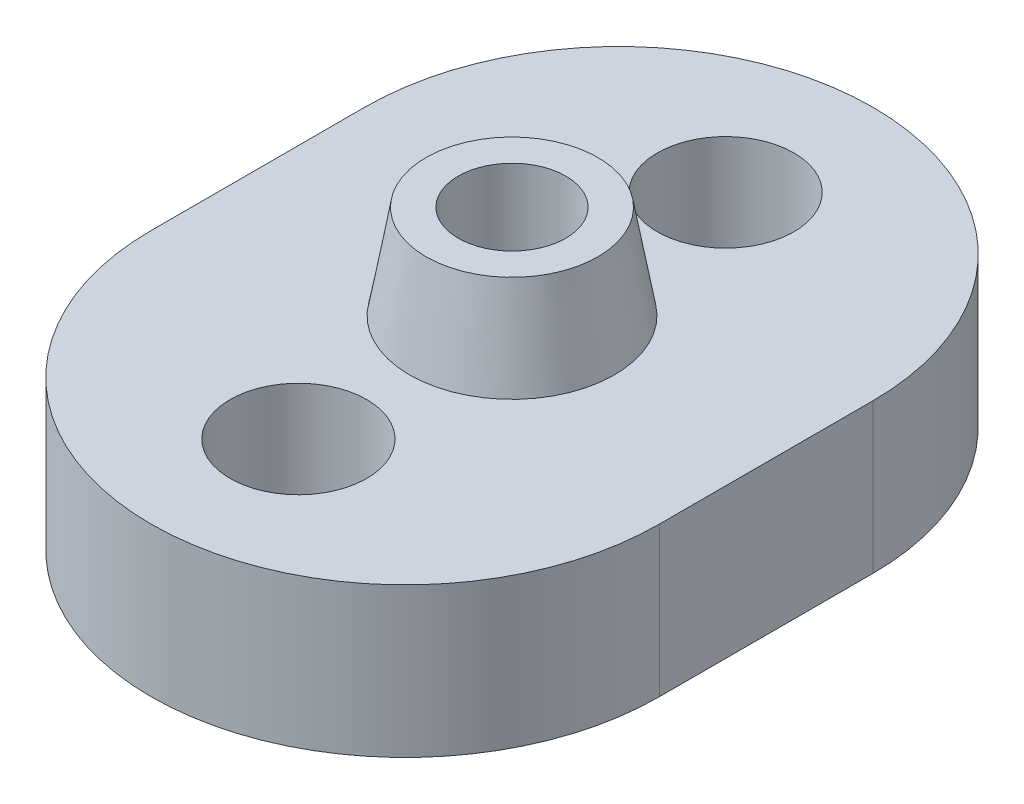
ISO-10303-21;
HEADER;
FILE_DESCRIPTION(('STEP AP214'),'2;1');
FILE_NAME('part.step','',(''),(''),'','','');
FILE_SCHEMA(('AUTOMOTIVE_DESIGN { 1 0 10303 214 1 1 1 1 }'));
ENDSEC;
DATA;
#1=APPLICATION_CONTEXT('core data for automotive mechanical design processes');
#2=APPLICATION_PROTOCOL_DEFINITION('international standard','automotive_design',2000,#1);
#3=PRODUCT_CONTEXT('',#1,'mechanical');
#4=PRODUCT('Part','Part','',(#3));
#5=PRODUCT_RELATED_PRODUCT_CATEGORY('part','',(#4));
#6=PRODUCT_DEFINITION_FORMATION('','',#4);
#7=PRODUCT_DEFINITION_CONTEXT('part definition',#1,'design');
#8=PRODUCT_DEFINITION('design','',#6,#7);
#9=PRODUCT_DEFINITION_SHAPE('','',#8);
#10=(LENGTH_UNIT() NAMED_UNIT(*) SI_UNIT(.MILLI.,.METRE.));
#11=(NAMED_UNIT(*) PLANE_ANGLE_UNIT() SI_UNIT($,.RADIAN.));
#12=(NAMED_UNIT(*) SI_UNIT($,.STERADIAN.) SOLID_ANGLE_UNIT());
#13=UNCERTAINTY_MEASURE_WITH_UNIT(LENGTH_MEASURE(1.E-05),#10,'distance_accuracy_value','');
#14=(GEOMETRIC_REPRESENTATION_CONTEXT(3) GLOBAL_UNCERTAINTY_ASSIGNED_CONTEXT((#13)) GLOBAL_UNIT_ASSIGNED_CONTEXT((#10,
#11,#12)) REPRESENTATION_CONTEXT('',''));
#15=CARTESIAN_POINT('',(0.,0.,0.));
#16=DIRECTION('',(0.,0.,1.));
#17=DIRECTION('',(1.,0.,0.));
#18=AXIS2_PLACEMENT_3D('',#15,#16,#17);
#19=CARTESIAN_POINT('',(0.,0.,0.));
#20=DIRECTION('',(0.,-1.,0.));
#21=DIRECTION('',(0.,0.,1.));
#22=AXIS2_PLACEMENT_3D('',#19,#20,#21);
#23=CONICAL_SURFACE('',#22,2.4,0.174532925199433);
#24=CARTESIAN_POINT('',(0.,2.2,0.));
#25=DIRECTION('',(0.,1.,0.));
#26=DIRECTION('',(0.,0.,1.));
#27=AXIS2_PLACEMENT_3D('',#24,#25,#26);
#28=CIRCLE('',#27,2.01208064244138);
#29=CARTESIAN_POINT('',(0.,2.2,2.01208064244138));
#30=VERTEX_POINT('',#29);
#31=EDGE_CURVE('E11',#30,#30,#28,.T.);
#32=ORIENTED_EDGE('',*,*,#31,.F.);
#33=EDGE_LOOP('',(#32));
#34=FACE_BOUND('',#33,.T.);
#35=CARTESIAN_POINT('',(0.,0.,0.));
#36=DIRECTION('',(0.,1.,0.));
#37=DIRECTION('',(0.,0.,1.));
#38=AXIS2_PLACEMENT_3D('',#35,#36,#37);
#39=CIRCLE('',#38,2.4);
#40=CARTESIAN_POINT('',(0.,0.,2.4));
#41=VERTEX_POINT('',#40);
#42=EDGE_CURVE('E43',#41,#41,#39,.T.);
#43=ORIENTED_EDGE('',*,*,#42,.T.);
#44=EDGE_LOOP('',(#43));
#45=FACE_BOUND('',#44,.T.);
#46=ADVANCED_FACE('F34',(#34,#45),#23,.T.);
#47=CARTESIAN_POINT('',(0.,2.2,0.));
#48=DIRECTION('',(0.,1.,0.));
#49=DIRECTION('',(0.,0.,1.));
#50=AXIS2_PLACEMENT_3D('',#47,#48,#49);
#51=PLANE('',#50);
#52=CARTESIAN_POINT('',(0.,2.2,0.));
#53=DIRECTION('',(0.,-1.,0.));
#54=DIRECTION('',(0.,0.,-1.));
#55=AXIS2_PLACEMENT_3D('',#52,#53,#54);
#56=CIRCLE('',#55,1.26);
#57=CARTESIAN_POINT('',(0.,2.2,-1.26));
#58=VERTEX_POINT('',#57);
#59=EDGE_CURVE('E137',#58,#58,#56,.T.);
#60=ORIENTED_EDGE('',*,*,#59,.T.);
#61=EDGE_LOOP('',(#60));
#62=FACE_BOUND('',#61,.T.);
#63=ORIENTED_EDGE('',*,*,#31,.T.);
#64=EDGE_LOOP('',(#63));
#65=FACE_BOUND('',#64,.T.);
#66=ADVANCED_FACE('F148',(#62,#65),#51,.T.);
#67=CARTESIAN_POINT('',(0.,-3.5,-2.5));
#68=DIRECTION('',(0.,-1.,0.));
#69=DIRECTION('',(0.,0.,-1.));
#70=AXIS2_PLACEMENT_3D('',#67,#68,#69);
#71=PLANE('',#70);
#72=CARTESIAN_POINT('',(0.,-3.5,0.));
#73=DIRECTION('',(0.,-1.,0.));
#74=DIRECTION('',(0.,0.,-1.));
#75=AXIS2_PLACEMENT_3D('',#72,#73,#74);
#76=CIRCLE('',#75,1.26);
#77=CARTESIAN_POINT('',(0.,-3.5,-1.26));
#78=VERTEX_POINT('',#77);
#79=EDGE_CURVE('E37',#78,#78,#76,.T.);
#80=ORIENTED_EDGE('',*,*,#79,.F.);
#81=EDGE_LOOP('',(#80));
#82=FACE_BOUND('',#81,.T.);
#83=CARTESIAN_POINT('',(0.,-3.5,-5.));
#84=DIRECTION('',(0.,-1.,0.));
#85=DIRECTION('',(0.,0.,-1.));
#86=AXIS2_PLACEMENT_3D('',#83,#84,#85);
#87=CIRCLE('',#86,1.6);
#88=CARTESIAN_POINT('',(0.,-3.5,-6.6));
#89=VERTEX_POINT('',#88);
#90=EDGE_CURVE('E106',#89,#89,#87,.T.);
#91=ORIENTED_EDGE('',*,*,#90,.F.);
#92=EDGE_LOOP('',(#91));
#93=FACE_BOUND('',#92,.T.);
#94=CARTESIAN_POINT('',(0.,-3.5,-2.5));
#95=DIRECTION('',(0.,-1.,0.));
#96=DIRECTION('',(0.,0.,-1.));
#97=AXIS2_PLACEMENT_3D('',#94,#95,#96);
#98=CIRCLE('',#97,5.95);
#99=CARTESIAN_POINT('',(-5.95,-3.5,-2.5));
#100=VERTEX_POINT('',#99);
#101=CARTESIAN_POINT('',(5.95,-3.5,-2.5));
#102=VERTEX_POINT('',#101);
#103=EDGE_CURVE('E88',#100,#102,#98,.T.);
#104=ORIENTED_EDGE('',*,*,#103,.T.);
#105=DIRECTION('',(0.,0.,1.));
#106=VECTOR('',#105,1.);
#107=CARTESIAN_POINT('',(5.95,-3.5,-2.5));
#108=LINE('',#107,#106);
#109=CARTESIAN_POINT('',(5.95,-3.5,2.5));
#110=VERTEX_POINT('',#109);
#111=EDGE_CURVE('E82',#102,#110,#108,.T.);
#112=ORIENTED_EDGE('',*,*,#111,.T.);
#113=CARTESIAN_POINT('',(0.,-3.5,2.5));
#114=DIRECTION('',(0.,-1.,0.));
#115=DIRECTION('',(0.,0.,-1.));
#116=AXIS2_PLACEMENT_3D('',#113,#114,#115);
#117=CIRCLE('',#116,5.95);
#118=CARTESIAN_POINT('',(-5.95,-3.5,2.5));
#119=VERTEX_POINT('',#118);
#120=EDGE_CURVE('E86',#110,#119,#117,.T.);
#121=ORIENTED_EDGE('',*,*,#120,.T.);
#122=DIRECTION('',(0.,0.,-1.));
#123=VECTOR('',#122,1.);
#124=CARTESIAN_POINT('',(-5.95,-3.5,-2.5));
#125=LINE('',#124,#123);
#126=EDGE_CURVE('E51',#119,#100,#125,.T.);
#127=ORIENTED_EDGE('',*,*,#126,.T.);
#128=EDGE_LOOP('',(#104,#112,#121,#127));
#129=FACE_BOUND('',#128,.T.);
#130=CARTESIAN_POINT('',(0.,-3.5,5.));
#131=DIRECTION('',(0.,-1.,0.));
#132=DIRECTION('',(0.,0.,-1.));
#133=AXIS2_PLACEMENT_3D('',#130,#131,#132);
#134=CIRCLE('',#133,1.6);
#135=CARTESIAN_POINT('',(0.,-3.5,3.4));
#136=VERTEX_POINT('',#135);
#137=EDGE_CURVE('E132',#136,#136,#134,.T.);
#138=ORIENTED_EDGE('',*,*,#137,.F.);
#139=EDGE_LOOP('',(#138));
#140=FACE_BOUND('',#139,.T.);
#141=ADVANCED_FACE('F83',(#82,#93,#129,#140),#71,.T.);
#142=CARTESIAN_POINT('',(0.,0.,-2.5));
#143=DIRECTION('',(0.,-1.,0.));
#144=DIRECTION('',(0.,0.,-1.));
#145=AXIS2_PLACEMENT_3D('',#142,#143,#144);
#146=PLANE('',#145);
#147=ORIENTED_EDGE('',*,*,#42,.F.);
#148=EDGE_LOOP('',(#147));
#149=FACE_BOUND('',#148,.T.);
#150=CARTESIAN_POINT('',(0.,0.,-2.5));
#151=DIRECTION('',(0.,-1.,0.));
#152=DIRECTION('',(0.,0.,-1.));
#153=AXIS2_PLACEMENT_3D('',#150,#151,#152);
#154=CIRCLE('',#153,5.95);
#155=CARTESIAN_POINT('',(-5.95,0.,-2.5));
#156=VERTEX_POINT('',#155);
#157=CARTESIAN_POINT('',(5.95,0.,-2.5));
#158=VERTEX_POINT('',#157);
#159=EDGE_CURVE('E103',#156,#158,#154,.T.);
#160=ORIENTED_EDGE('',*,*,#159,.F.);
#161=DIRECTION('',(0.,0.,-1.));
#162=VECTOR('',#161,1.);
#163=CARTESIAN_POINT('',(-5.95,0.,-2.5));
#164=LINE('',#163,#162);
#165=CARTESIAN_POINT('',(-5.95,0.,2.5));
#166=VERTEX_POINT('',#165);
#167=EDGE_CURVE('E74',#166,#156,#164,.T.);
#168=ORIENTED_EDGE('',*,*,#167,.F.);
#169=CARTESIAN_POINT('',(0.,0.,2.5));
#170=DIRECTION('',(0.,-1.,0.));
#171=DIRECTION('',(0.,0.,-1.));
#172=AXIS2_PLACEMENT_3D('',#169,#170,#171);
#173=CIRCLE('',#172,5.95);
#174=CARTESIAN_POINT('',(5.95,0.,2.5));
#175=VERTEX_POINT('',#174);
#176=EDGE_CURVE('E68',#175,#166,#173,.T.);
#177=ORIENTED_EDGE('',*,*,#176,.F.);
#178=DIRECTION('',(0.,0.,1.));
#179=VECTOR('',#178,1.);
#180=CARTESIAN_POINT('',(5.95,0.,-2.5));
#181=LINE('',#180,#179);
#182=EDGE_CURVE('E93',#158,#175,#181,.T.);
#183=ORIENTED_EDGE('',*,*,#182,.F.);
#184=EDGE_LOOP('',(#160,#168,#177,#183));
#185=FACE_BOUND('',#184,.T.);
#186=CARTESIAN_POINT('',(0.,0.,-5.));
#187=DIRECTION('',(0.,-1.,0.));
#188=DIRECTION('',(0.,0.,-1.));
#189=AXIS2_PLACEMENT_3D('',#186,#187,#188);
#190=CIRCLE('',#189,1.6);
#191=CARTESIAN_POINT('',(0.,0.,-6.6));
#192=VERTEX_POINT('',#191);
#193=EDGE_CURVE('E127',#192,#192,#190,.T.);
#194=ORIENTED_EDGE('',*,*,#193,.T.);
#195=EDGE_LOOP('',(#194));
#196=FACE_BOUND('',#195,.T.);
#197=CARTESIAN_POINT('',(0.,0.,5.));
#198=DIRECTION('',(0.,-1.,0.));
#199=DIRECTION('',(0.,0.,-1.));
#200=AXIS2_PLACEMENT_3D('',#197,#198,#199);
#201=CIRCLE('',#200,1.6);
#202=CARTESIAN_POINT('',(0.,0.,3.4));
#203=VERTEX_POINT('',#202);
#204=EDGE_CURVE('E130',#203,#203,#201,.T.);
#205=ORIENTED_EDGE('',*,*,#204,.T.);
#206=EDGE_LOOP('',(#205));
#207=FACE_BOUND('',#206,.T.);
#208=ADVANCED_FACE('F117',(#149,#185,#196,#207),#146,.F.);
#209=CARTESIAN_POINT('',(0.,-3.5,-2.5));
#210=DIRECTION('',(0.,1.,0.));
#211=DIRECTION('',(0.,0.,1.));
#212=AXIS2_PLACEMENT_3D('',#209,#210,#211);
#213=CYLINDRICAL_SURFACE('',#212,5.95);
#214=ORIENTED_EDGE('',*,*,#159,.T.);
#215=DIRECTION('',(0.,1.,0.));
#216=VECTOR('',#215,1.);
#217=CARTESIAN_POINT('',(5.95,-3.5,-2.5));
#218=LINE('',#217,#216);
#219=EDGE_CURVE('E94',#102,#158,#218,.T.);
#220=ORIENTED_EDGE('',*,*,#219,.F.);
#221=ORIENTED_EDGE('',*,*,#103,.F.);
#222=DIRECTION('',(0.,1.,0.));
#223=VECTOR('',#222,1.);
#224=CARTESIAN_POINT('',(-5.95,-3.5,-2.5));
#225=LINE('',#224,#223);
#226=EDGE_CURVE('E99',#100,#156,#225,.T.);
#227=ORIENTED_EDGE('',*,*,#226,.T.);
#228=EDGE_LOOP('',(#214,#220,#221,#227));
#229=FACE_BOUND('',#228,.T.);
#230=ADVANCED_FACE('F120',(#229),#213,.T.);
#231=CARTESIAN_POINT('',(5.95,-3.5,-2.5));
#232=DIRECTION('',(-1.,0.,0.));
#233=DIRECTION('',(0.,0.,1.));
#234=AXIS2_PLACEMENT_3D('',#231,#232,#233);
#235=PLANE('',#234);
#236=ORIENTED_EDGE('',*,*,#182,.T.);
#237=DIRECTION('',(0.,1.,0.));
#238=VECTOR('',#237,1.);
#239=CARTESIAN_POINT('',(5.95,-3.5,2.5));
#240=LINE('',#239,#238);
#241=EDGE_CURVE('E91',#110,#175,#240,.T.);
#242=ORIENTED_EDGE('',*,*,#241,.F.);
#243=ORIENTED_EDGE('',*,*,#111,.F.);
#244=ORIENTED_EDGE('',*,*,#219,.T.);
#245=EDGE_LOOP('',(#236,#242,#243,#244));
#246=FACE_BOUND('',#245,.T.);
#247=ADVANCED_FACE('F92',(#246),#235,.F.);
#248=CARTESIAN_POINT('',(0.,-3.5,2.5));
#249=DIRECTION('',(0.,1.,0.));
#250=DIRECTION('',(0.,0.,1.));
#251=AXIS2_PLACEMENT_3D('',#248,#249,#250);
#252=CYLINDRICAL_SURFACE('',#251,5.95);
#253=ORIENTED_EDGE('',*,*,#176,.T.);
#254=DIRECTION('',(0.,1.,0.));
#255=VECTOR('',#254,1.);
#256=CARTESIAN_POINT('',(-5.95,-3.5,2.5));
#257=LINE('',#256,#255);
#258=EDGE_CURVE('E95',#119,#166,#257,.T.);
#259=ORIENTED_EDGE('',*,*,#258,.F.);
#260=ORIENTED_EDGE('',*,*,#120,.F.);
#261=ORIENTED_EDGE('',*,*,#241,.T.);
#262=EDGE_LOOP('',(#253,#259,#260,#261));
#263=FACE_BOUND('',#262,.T.);
#264=ADVANCED_FACE('F97',(#263),#252,.T.);
#265=CARTESIAN_POINT('',(-5.95,-3.5,-2.5));
#266=DIRECTION('',(1.,0.,0.));
#267=DIRECTION('',(0.,0.,-1.));
#268=AXIS2_PLACEMENT_3D('',#265,#266,#267);
#269=PLANE('',#268);
#270=ORIENTED_EDGE('',*,*,#167,.T.);
#271=ORIENTED_EDGE('',*,*,#226,.F.);
#272=ORIENTED_EDGE('',*,*,#126,.F.);
#273=ORIENTED_EDGE('',*,*,#258,.T.);
#274=EDGE_LOOP('',(#270,#271,#272,#273));
#275=FACE_BOUND('',#274,.T.);
#276=ADVANCED_FACE('F199',(#275),#269,.F.);
#277=CARTESIAN_POINT('',(0.,-3.5,-5.));
#278=DIRECTION('',(0.,1.,0.));
#279=DIRECTION('',(0.,0.,1.));
#280=AXIS2_PLACEMENT_3D('',#277,#278,#279);
#281=CYLINDRICAL_SURFACE('',#280,1.6);
#282=ORIENTED_EDGE('',*,*,#90,.T.);
#283=EDGE_LOOP('',(#282));
#284=FACE_BOUND('',#283,.T.);
#285=ORIENTED_EDGE('',*,*,#193,.F.);
#286=EDGE_LOOP('',(#285));
#287=FACE_BOUND('',#286,.T.);
#288=ADVANCED_FACE('F144',(#284,#287),#281,.F.);
#289=CARTESIAN_POINT('',(0.,-3.5,5.));
#290=DIRECTION('',(0.,1.,0.));
#291=DIRECTION('',(0.,0.,1.));
#292=AXIS2_PLACEMENT_3D('',#289,#290,#291);
#293=CYLINDRICAL_SURFACE('',#292,1.6);
#294=ORIENTED_EDGE('',*,*,#137,.T.);
#295=EDGE_LOOP('',(#294));
#296=FACE_BOUND('',#295,.T.);
#297=ORIENTED_EDGE('',*,*,#204,.F.);
#298=EDGE_LOOP('',(#297));
#299=FACE_BOUND('',#298,.T.);
#300=ADVANCED_FACE('F174',(#296,#299),#293,.F.);
#301=CARTESIAN_POINT('',(0.,2.2,0.));
#302=DIRECTION('',(0.,-1.,0.));
#303=DIRECTION('',(0.,0.,-1.));
#304=AXIS2_PLACEMENT_3D('',#301,#302,#303);
#305=CYLINDRICAL_SURFACE('',#304,1.26);
#306=ORIENTED_EDGE('',*,*,#79,.T.);
#307=EDGE_LOOP('',(#306));
#308=FACE_BOUND('',#307,.T.);
#309=ORIENTED_EDGE('',*,*,#59,.F.);
#310=EDGE_LOOP('',(#309));
#311=FACE_BOUND('',#310,.T.);
#312=ADVANCED_FACE('F184',(#308,#311),#305,.F.);
#313=CLOSED_SHELL('',(#46,#66,#141,#208,#230,#247,#264,#276,#288,#300,#312));
#314=MANIFOLD_SOLID_BREP('B2',#313);
#315=ADVANCED_BREP_SHAPE_REPRESENTATION('',(#18,#314),#14);
#316=SHAPE_DEFINITION_REPRESENTATION(#9,#315);
ENDSEC;
END-ISO-10303-21;
